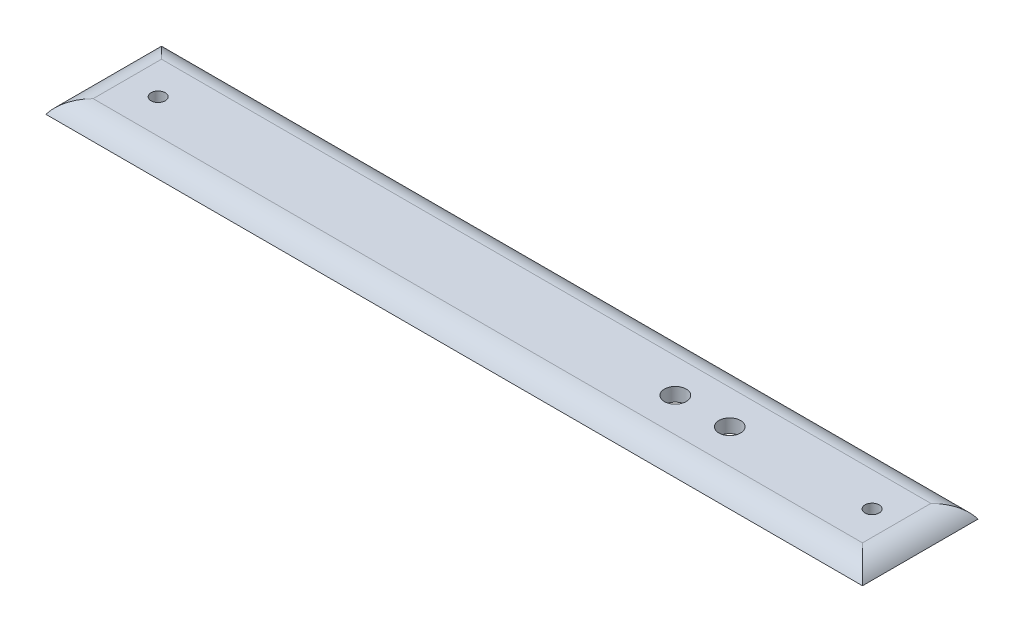
ISO-10303-21;
HEADER;
FILE_DESCRIPTION(('STEP AP214'),'2;1');
FILE_NAME('part.step','',(''),(''),'','','');
FILE_SCHEMA(('AUTOMOTIVE_DESIGN { 1 0 10303 214 1 1 1 1 }'));
ENDSEC;
DATA;
#1=APPLICATION_CONTEXT('core data for automotive mechanical design processes');
#2=APPLICATION_PROTOCOL_DEFINITION('international standard','automotive_design',2000,#1);
#3=PRODUCT_CONTEXT('',#1,'mechanical');
#4=PRODUCT('Part','Part','',(#3));
#5=PRODUCT_RELATED_PRODUCT_CATEGORY('part','',(#4));
#6=PRODUCT_DEFINITION_FORMATION('','',#4);
#7=PRODUCT_DEFINITION_CONTEXT('part definition',#1,'design');
#8=PRODUCT_DEFINITION('design','',#6,#7);
#9=PRODUCT_DEFINITION_SHAPE('','',#8);
#10=(LENGTH_UNIT() NAMED_UNIT(*) SI_UNIT(.MILLI.,.METRE.));
#11=(NAMED_UNIT(*) PLANE_ANGLE_UNIT() SI_UNIT($,.RADIAN.));
#12=(NAMED_UNIT(*) SI_UNIT($,.STERADIAN.) SOLID_ANGLE_UNIT());
#13=UNCERTAINTY_MEASURE_WITH_UNIT(LENGTH_MEASURE(1.E-05),#10,'distance_accuracy_value','');
#14=(GEOMETRIC_REPRESENTATION_CONTEXT(3) GLOBAL_UNCERTAINTY_ASSIGNED_CONTEXT((#13)) GLOBAL_UNIT_ASSIGNED_CONTEXT((#10,
#11,#12)) REPRESENTATION_CONTEXT('',''));
#15=CARTESIAN_POINT('',(0.,0.,0.));
#16=DIRECTION('',(0.,0.,1.));
#17=DIRECTION('',(1.,0.,0.));
#18=AXIS2_PLACEMENT_3D('',#15,#16,#17);
#19=CARTESIAN_POINT('',(-130.,5.,0.));
#20=DIRECTION('',(0.,-1.,0.));
#21=DIRECTION('',(0.,0.,-1.));
#22=AXIS2_PLACEMENT_3D('',#19,#20,#21);
#23=CYLINDRICAL_SURFACE('',#22,2.59999999999999);
#24=CARTESIAN_POINT('',(-130.,5.,0.));
#25=DIRECTION('',(0.,1.,0.));
#26=DIRECTION('',(0.,0.,1.));
#27=AXIS2_PLACEMENT_3D('',#24,#25,#26);
#28=CIRCLE('',#27,2.59999999999999);
#29=CARTESIAN_POINT('',(-130.,5.,2.59999999999999));
#30=VERTEX_POINT('',#29);
#31=EDGE_CURVE('E136',#30,#30,#28,.T.);
#32=ORIENTED_EDGE('',*,*,#31,.T.);
#33=EDGE_LOOP('',(#32));
#34=FACE_BOUND('',#33,.T.);
#35=CARTESIAN_POINT('',(-130.,0.,0.));
#36=DIRECTION('',(0.,1.,0.));
#37=DIRECTION('',(0.,0.,1.));
#38=AXIS2_PLACEMENT_3D('',#35,#36,#37);
#39=CIRCLE('',#38,2.59999999999999);
#40=CARTESIAN_POINT('',(-130.,0.,2.59999999999999));
#41=VERTEX_POINT('',#40);
#42=EDGE_CURVE('E117',#41,#41,#39,.T.);
#43=ORIENTED_EDGE('',*,*,#42,.F.);
#44=EDGE_LOOP('',(#43));
#45=FACE_BOUND('',#44,.T.);
#46=ADVANCED_FACE('F49',(#34,#45),#23,.F.);
#47=CARTESIAN_POINT('',(132.3,5.,0.));
#48=DIRECTION('',(0.,-1.,0.));
#49=DIRECTION('',(0.,0.,-1.));
#50=AXIS2_PLACEMENT_3D('',#47,#48,#49);
#51=CYLINDRICAL_SURFACE('',#50,2.59999999999999);
#52=CARTESIAN_POINT('',(132.3,5.,0.));
#53=DIRECTION('',(0.,1.,0.));
#54=DIRECTION('',(0.,0.,1.));
#55=AXIS2_PLACEMENT_3D('',#52,#53,#54);
#56=CIRCLE('',#55,2.59999999999999);
#57=CARTESIAN_POINT('',(132.3,5.,2.59999999999999));
#58=VERTEX_POINT('',#57);
#59=EDGE_CURVE('E139',#58,#58,#56,.T.);
#60=ORIENTED_EDGE('',*,*,#59,.T.);
#61=EDGE_LOOP('',(#60));
#62=FACE_BOUND('',#61,.T.);
#63=CARTESIAN_POINT('',(132.3,0.,0.));
#64=DIRECTION('',(0.,1.,0.));
#65=DIRECTION('',(0.,0.,1.));
#66=AXIS2_PLACEMENT_3D('',#63,#64,#65);
#67=CIRCLE('',#66,2.59999999999999);
#68=CARTESIAN_POINT('',(132.3,0.,2.59999999999999));
#69=VERTEX_POINT('',#68);
#70=EDGE_CURVE('E132',#69,#69,#67,.T.);
#71=ORIENTED_EDGE('',*,*,#70,.F.);
#72=EDGE_LOOP('',(#71));
#73=FACE_BOUND('',#72,.T.);
#74=ADVANCED_FACE('F176',(#62,#73),#51,.F.);
#75=CARTESIAN_POINT('',(0.,5.,0.));
#76=DIRECTION('',(0.,1.,0.));
#77=DIRECTION('',(0.,0.,1.));
#78=AXIS2_PLACEMENT_3D('',#75,#76,#77);
#79=PLANE('',#78);
#80=CARTESIAN_POINT('',(60.,5.,0.));
#81=DIRECTION('',(0.,1.,0.));
#82=DIRECTION('',(0.,0.,1.));
#83=AXIS2_PLACEMENT_3D('',#80,#81,#82);
#84=CIRCLE('',#83,4.00000000000001);
#85=CARTESIAN_POINT('',(60.,5.,4.00000000000001));
#86=VERTEX_POINT('',#85);
#87=EDGE_CURVE('E152',#86,#86,#84,.T.);
#88=ORIENTED_EDGE('',*,*,#87,.F.);
#89=EDGE_LOOP('',(#88));
#90=FACE_BOUND('',#89,.T.);
#91=CARTESIAN_POINT('',(80.,5.,0.));
#92=DIRECTION('',(0.,1.,0.));
#93=DIRECTION('',(0.,0.,1.));
#94=AXIS2_PLACEMENT_3D('',#91,#92,#93);
#95=CIRCLE('',#94,4.00000000000001);
#96=CARTESIAN_POINT('',(80.,5.,4.00000000000001));
#97=VERTEX_POINT('',#96);
#98=EDGE_CURVE('E161',#97,#97,#95,.T.);
#99=ORIENTED_EDGE('',*,*,#98,.F.);
#100=EDGE_LOOP('',(#99));
#101=FACE_BOUND('',#100,.T.);
#102=DIRECTION('',(-1.,0.,0.));
#103=VECTOR('',#102,1.);
#104=CARTESIAN_POINT('',(150.,5.,12.5547459621556));
#105=LINE('',#104,#103);
#106=CARTESIAN_POINT('',(-141.339745962156,5.,12.5547459621556));
#107=VERTEX_POINT('',#106);
#108=CARTESIAN_POINT('',(141.339745962156,5.,12.5547459621556));
#109=VERTEX_POINT('',#108);
#110=EDGE_CURVE('E59',#107,#109,#105,.F.);
#111=ORIENTED_EDGE('',*,*,#110,.T.);
#112=DIRECTION('',(0.,0.,-1.));
#113=VECTOR('',#112,1.);
#114=CARTESIAN_POINT('',(141.339745962156,5.,-21.215));
#115=LINE('',#114,#113);
#116=CARTESIAN_POINT('',(141.339745962156,5.,-12.5547459621556));
#117=VERTEX_POINT('',#116);
#118=EDGE_CURVE('E11',#109,#117,#115,.T.);
#119=ORIENTED_EDGE('',*,*,#118,.T.);
#120=DIRECTION('',(-1.,0.,0.));
#121=VECTOR('',#120,1.);
#122=CARTESIAN_POINT('',(-150.,5.,-12.5547459621556));
#123=LINE('',#122,#121);
#124=CARTESIAN_POINT('',(-141.339745962156,5.,-12.5547459621556));
#125=VERTEX_POINT('',#124);
#126=EDGE_CURVE('E107',#117,#125,#123,.T.);
#127=ORIENTED_EDGE('',*,*,#126,.T.);
#128=DIRECTION('',(0.,0.,-1.));
#129=VECTOR('',#128,1.);
#130=CARTESIAN_POINT('',(-141.339745962156,5.,21.215));
#131=LINE('',#130,#129);
#132=EDGE_CURVE('E70',#125,#107,#131,.F.);
#133=ORIENTED_EDGE('',*,*,#132,.T.);
#134=EDGE_LOOP('',(#111,#119,#127,#133));
#135=FACE_BOUND('',#134,.T.);
#136=ORIENTED_EDGE('',*,*,#31,.F.);
#137=EDGE_LOOP('',(#136));
#138=FACE_BOUND('',#137,.T.);
#139=ORIENTED_EDGE('',*,*,#59,.F.);
#140=EDGE_LOOP('',(#139));
#141=FACE_BOUND('',#140,.T.);
#142=ADVANCED_FACE('F179',(#90,#101,#135,#138,#141),#79,.T.);
#143=CARTESIAN_POINT('',(0.,0.,0.));
#144=DIRECTION('',(0.,1.,0.));
#145=DIRECTION('',(0.,0.,1.));
#146=AXIS2_PLACEMENT_3D('',#143,#144,#145);
#147=PLANE('',#146);
#148=CARTESIAN_POINT('',(60.,0.,0.));
#149=DIRECTION('',(0.,1.,0.));
#150=DIRECTION('',(0.,0.,1.));
#151=AXIS2_PLACEMENT_3D('',#148,#149,#150);
#152=CIRCLE('',#151,4.00000000000001);
#153=CARTESIAN_POINT('',(60.,0.,4.00000000000001));
#154=VERTEX_POINT('',#153);
#155=EDGE_CURVE('E53',#154,#154,#152,.T.);
#156=ORIENTED_EDGE('',*,*,#155,.T.);
#157=EDGE_LOOP('',(#156));
#158=FACE_BOUND('',#157,.T.);
#159=CARTESIAN_POINT('',(80.,0.,0.));
#160=DIRECTION('',(0.,1.,0.));
#161=DIRECTION('',(0.,0.,1.));
#162=AXIS2_PLACEMENT_3D('',#159,#160,#161);
#163=CIRCLE('',#162,4.00000000000001);
#164=CARTESIAN_POINT('',(80.,0.,4.00000000000001));
#165=VERTEX_POINT('',#164);
#166=EDGE_CURVE('E149',#165,#165,#163,.T.);
#167=ORIENTED_EDGE('',*,*,#166,.T.);
#168=EDGE_LOOP('',(#167));
#169=FACE_BOUND('',#168,.T.);
#170=ORIENTED_EDGE('',*,*,#42,.T.);
#171=EDGE_LOOP('',(#170));
#172=FACE_BOUND('',#171,.T.);
#173=DIRECTION('',(0.,0.,1.));
#174=VECTOR('',#173,1.);
#175=CARTESIAN_POINT('',(150.,0.,0.));
#176=LINE('',#175,#174);
#177=CARTESIAN_POINT('',(150.,0.,-21.215));
#178=VERTEX_POINT('',#177);
#179=CARTESIAN_POINT('',(150.,0.,21.215));
#180=VERTEX_POINT('',#179);
#181=EDGE_CURVE('E96',#178,#180,#176,.T.);
#182=ORIENTED_EDGE('',*,*,#181,.T.);
#183=DIRECTION('',(1.,0.,0.));
#184=VECTOR('',#183,1.);
#185=CARTESIAN_POINT('',(0.,0.,21.215));
#186=LINE('',#185,#184);
#187=CARTESIAN_POINT('',(-150.,0.,21.215));
#188=VERTEX_POINT('',#187);
#189=EDGE_CURVE('E129',#188,#180,#186,.T.);
#190=ORIENTED_EDGE('',*,*,#189,.F.);
#191=DIRECTION('',(0.,0.,1.));
#192=VECTOR('',#191,1.);
#193=CARTESIAN_POINT('',(-150.,0.,0.));
#194=LINE('',#193,#192);
#195=CARTESIAN_POINT('',(-150.,0.,-21.215));
#196=VERTEX_POINT('',#195);
#197=EDGE_CURVE('E98',#196,#188,#194,.T.);
#198=ORIENTED_EDGE('',*,*,#197,.F.);
#199=DIRECTION('',(1.,0.,0.));
#200=VECTOR('',#199,1.);
#201=CARTESIAN_POINT('',(0.,0.,-21.215));
#202=LINE('',#201,#200);
#203=EDGE_CURVE('E91',#196,#178,#202,.T.);
#204=ORIENTED_EDGE('',*,*,#203,.T.);
#205=EDGE_LOOP('',(#182,#190,#198,#204));
#206=FACE_BOUND('',#205,.T.);
#207=ORIENTED_EDGE('',*,*,#70,.T.);
#208=EDGE_LOOP('',(#207));
#209=FACE_BOUND('',#208,.T.);
#210=ADVANCED_FACE('F93',(#158,#169,#172,#206,#209),#147,.F.);
#211=CARTESIAN_POINT('',(-141.339745962156,-5.,0.));
#212=DIRECTION('',(0.,0.,1.));
#213=DIRECTION('',(1.,0.,0.));
#214=AXIS2_PLACEMENT_3D('',#211,#212,#213);
#215=CYLINDRICAL_SURFACE('',#214,10.);
#216=CARTESIAN_POINT('',(-141.339745962156,-5.,12.5547459621556));
#217=DIRECTION('',(0.707106781186547,0.,0.707106781186547));
#218=DIRECTION('',(-0.707106781186547,0.,0.707106781186547));
#219=AXIS2_PLACEMENT_3D('',#216,#217,#218);
#220=ELLIPSE('',#219,14.1421356237309,10.);
#221=EDGE_CURVE('E110',#107,#188,#220,.T.);
#222=ORIENTED_EDGE('',*,*,#221,.F.);
#223=ORIENTED_EDGE('',*,*,#132,.F.);
#224=CARTESIAN_POINT('',(-141.339745962156,-5.,-12.5547459621556));
#225=DIRECTION('',(0.707106781186547,0.,-0.707106781186547));
#226=DIRECTION('',(0.707106781186547,0.,0.707106781186547));
#227=AXIS2_PLACEMENT_3D('',#224,#225,#226);
#228=ELLIPSE('',#227,14.1421356237309,10.);
#229=EDGE_CURVE('E123',#196,#125,#228,.T.);
#230=ORIENTED_EDGE('',*,*,#229,.F.);
#231=ORIENTED_EDGE('',*,*,#197,.T.);
#232=EDGE_LOOP('',(#222,#223,#230,#231));
#233=FACE_BOUND('',#232,.T.);
#234=ADVANCED_FACE('F51',(#233),#215,.T.);
#235=CARTESIAN_POINT('',(0.,-5.,-12.5547459621556));
#236=DIRECTION('',(1.,0.,0.));
#237=DIRECTION('',(0.,0.,-1.));
#238=AXIS2_PLACEMENT_3D('',#235,#236,#237);
#239=CYLINDRICAL_SURFACE('',#238,10.);
#240=ORIENTED_EDGE('',*,*,#229,.T.);
#241=ORIENTED_EDGE('',*,*,#126,.F.);
#242=CARTESIAN_POINT('',(141.339745962156,-5.,-12.5547459621556));
#243=DIRECTION('',(0.707106781186547,0.,0.707106781186547));
#244=DIRECTION('',(0.707106781186547,0.,-0.707106781186547));
#245=AXIS2_PLACEMENT_3D('',#242,#243,#244);
#246=ELLIPSE('',#245,14.1421356237309,10.);
#247=EDGE_CURVE('E105',#178,#117,#246,.T.);
#248=ORIENTED_EDGE('',*,*,#247,.F.);
#249=ORIENTED_EDGE('',*,*,#203,.F.);
#250=EDGE_LOOP('',(#240,#241,#248,#249));
#251=FACE_BOUND('',#250,.T.);
#252=ADVANCED_FACE('F106',(#251),#239,.T.);
#253=CARTESIAN_POINT('',(0.,-5.,12.5547459621556));
#254=DIRECTION('',(1.,0.,0.));
#255=DIRECTION('',(0.,0.,-1.));
#256=AXIS2_PLACEMENT_3D('',#253,#254,#255);
#257=CYLINDRICAL_SURFACE('',#256,10.);
#258=ORIENTED_EDGE('',*,*,#221,.T.);
#259=ORIENTED_EDGE('',*,*,#189,.T.);
#260=CARTESIAN_POINT('',(141.339745962156,-5.,12.5547459621556));
#261=DIRECTION('',(0.707106781186547,0.,-0.707106781186547));
#262=DIRECTION('',(0.707106781186547,0.,0.707106781186547));
#263=AXIS2_PLACEMENT_3D('',#260,#261,#262);
#264=ELLIPSE('',#263,14.1421356237309,10.);
#265=EDGE_CURVE('E111',#109,#180,#264,.T.);
#266=ORIENTED_EDGE('',*,*,#265,.F.);
#267=ORIENTED_EDGE('',*,*,#110,.F.);
#268=EDGE_LOOP('',(#258,#259,#266,#267));
#269=FACE_BOUND('',#268,.T.);
#270=ADVANCED_FACE('F202',(#269),#257,.T.);
#271=CARTESIAN_POINT('',(141.339745962156,-5.,0.));
#272=DIRECTION('',(0.,0.,1.));
#273=DIRECTION('',(1.,0.,0.));
#274=AXIS2_PLACEMENT_3D('',#271,#272,#273);
#275=CYLINDRICAL_SURFACE('',#274,10.);
#276=ORIENTED_EDGE('',*,*,#247,.T.);
#277=ORIENTED_EDGE('',*,*,#118,.F.);
#278=ORIENTED_EDGE('',*,*,#265,.T.);
#279=ORIENTED_EDGE('',*,*,#181,.F.);
#280=EDGE_LOOP('',(#276,#277,#278,#279));
#281=FACE_BOUND('',#280,.T.);
#282=ADVANCED_FACE('F113',(#281),#275,.T.);
#283=CARTESIAN_POINT('',(80.,-5.,0.));
#284=DIRECTION('',(0.,1.,0.));
#285=DIRECTION('',(0.,0.,1.));
#286=AXIS2_PLACEMENT_3D('',#283,#284,#285);
#287=CYLINDRICAL_SURFACE('',#286,4.00000000000001);
#288=ORIENTED_EDGE('',*,*,#98,.T.);
#289=EDGE_LOOP('',(#288));
#290=FACE_BOUND('',#289,.T.);
#291=ORIENTED_EDGE('',*,*,#166,.F.);
#292=EDGE_LOOP('',(#291));
#293=FACE_BOUND('',#292,.T.);
#294=ADVANCED_FACE('F201',(#290,#293),#287,.F.);
#295=CARTESIAN_POINT('',(60.,-5.,0.));
#296=DIRECTION('',(0.,1.,0.));
#297=DIRECTION('',(0.,0.,1.));
#298=AXIS2_PLACEMENT_3D('',#295,#296,#297);
#299=CYLINDRICAL_SURFACE('',#298,4.00000000000001);
#300=ORIENTED_EDGE('',*,*,#87,.T.);
#301=EDGE_LOOP('',(#300));
#302=FACE_BOUND('',#301,.T.);
#303=ORIENTED_EDGE('',*,*,#155,.F.);
#304=EDGE_LOOP('',(#303));
#305=FACE_BOUND('',#304,.T.);
#306=ADVANCED_FACE('F293',(#302,#305),#299,.F.);
#307=CLOSED_SHELL('',(#46,#74,#142,#210,#234,#252,#270,#282,#294,#306));
#308=MANIFOLD_SOLID_BREP('B2',#307);
#309=ADVANCED_BREP_SHAPE_REPRESENTATION('',(#18,#308),#14);
#310=SHAPE_DEFINITION_REPRESENTATION(#9,#309);
ENDSEC;
END-ISO-10303-21;
